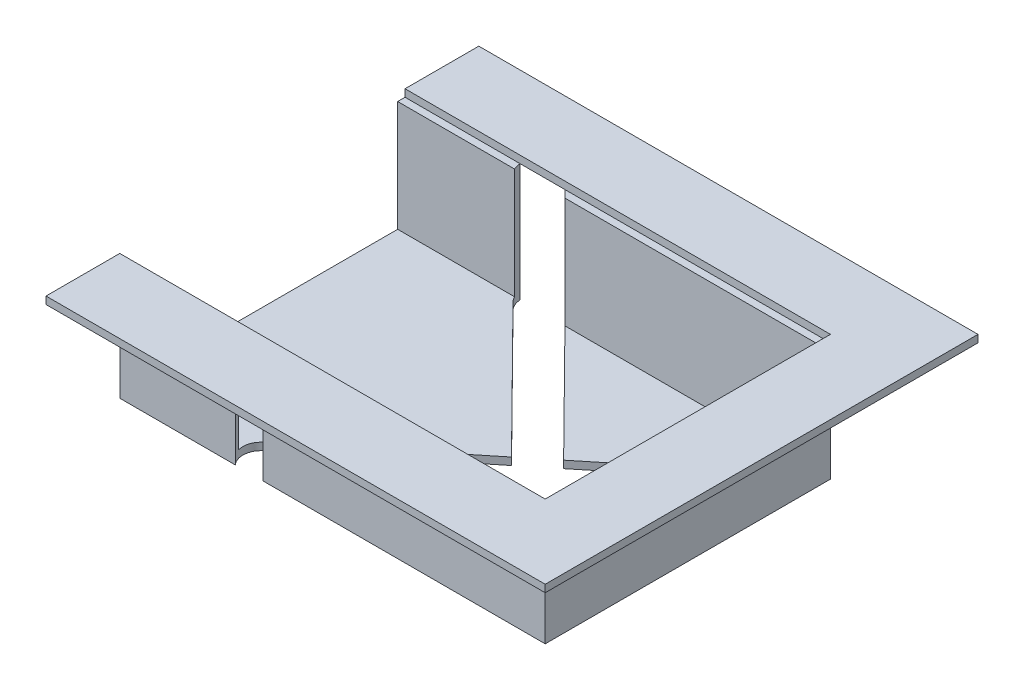
ISO-10303-21;
HEADER;
FILE_DESCRIPTION(('STEP AP214'),'2;1');
FILE_NAME('part.step','',(''),(''),'','','');
FILE_SCHEMA(('AUTOMOTIVE_DESIGN { 1 0 10303 214 1 1 1 1 }'));
ENDSEC;
DATA;
#1=APPLICATION_CONTEXT('core data for automotive mechanical design processes');
#2=APPLICATION_PROTOCOL_DEFINITION('international standard','automotive_design',2000,#1);
#3=PRODUCT_CONTEXT('',#1,'mechanical');
#4=PRODUCT('Part','Part','',(#3));
#5=PRODUCT_RELATED_PRODUCT_CATEGORY('part','',(#4));
#6=PRODUCT_DEFINITION_FORMATION('','',#4);
#7=PRODUCT_DEFINITION_CONTEXT('part definition',#1,'design');
#8=PRODUCT_DEFINITION('design','',#6,#7);
#9=PRODUCT_DEFINITION_SHAPE('','',#8);
#10=(LENGTH_UNIT() NAMED_UNIT(*) SI_UNIT(.MILLI.,.METRE.));
#11=(NAMED_UNIT(*) PLANE_ANGLE_UNIT() SI_UNIT($,.RADIAN.));
#12=(NAMED_UNIT(*) SI_UNIT($,.STERADIAN.) SOLID_ANGLE_UNIT());
#13=UNCERTAINTY_MEASURE_WITH_UNIT(LENGTH_MEASURE(1.E-05),#10,'distance_accuracy_value','');
#14=(GEOMETRIC_REPRESENTATION_CONTEXT(3) GLOBAL_UNCERTAINTY_ASSIGNED_CONTEXT((#13)) GLOBAL_UNIT_ASSIGNED_CONTEXT((#10,
#11,#12)) REPRESENTATION_CONTEXT('',''));
#15=CARTESIAN_POINT('',(0.,0.,0.));
#16=DIRECTION('',(0.,0.,1.));
#17=DIRECTION('',(1.,0.,0.));
#18=AXIS2_PLACEMENT_3D('',#15,#16,#17);
#19=CARTESIAN_POINT('',(0.,48.,0.));
#20=DIRECTION('',(0.,-1.,0.));
#21=DIRECTION('',(0.,0.,-1.));
#22=AXIS2_PLACEMENT_3D('',#19,#20,#21);
#23=PLANE('',#22);
#24=DIRECTION('',(0.776114000116265,0.,-0.630592625094466));
#25=VECTOR('',#24,1.);
#26=CARTESIAN_POINT('',(26.2072499737447,48.,32.2550768907627));
#27=LINE('',#26,#25);
#28=CARTESIAN_POINT('',(48.2617896283523,48.,14.335763421394));
#29=VERTEX_POINT('',#28);
#30=CARTESIAN_POINT('',(51.95409732066,48.,11.335763421394));
#31=VERTEX_POINT('',#30);
#32=EDGE_CURVE('E85',#29,#31,#27,.T.);
#33=ORIENTED_EDGE('',*,*,#32,.F.);
#34=DIRECTION('',(1.,0.,0.));
#35=VECTOR('',#34,1.);
#36=CARTESIAN_POINT('',(-13.016399676314,48.,14.335763421394));
#37=LINE('',#36,#35);
#38=CARTESIAN_POINT('',(162.983600323686,48.,14.3357634213939));
#39=VERTEX_POINT('',#38);
#40=EDGE_CURVE('E244',#29,#39,#37,.T.);
#41=ORIENTED_EDGE('',*,*,#40,.T.);
#42=DIRECTION('',(0.,0.,-1.));
#43=VECTOR('',#42,1.);
#44=CARTESIAN_POINT('',(162.983600323686,48.,14.3357634213939));
#45=LINE('',#44,#43);
#46=CARTESIAN_POINT('',(162.983600323686,48.,-101.664236578606));
#47=VERTEX_POINT('',#46);
#48=EDGE_CURVE('E248',#39,#47,#45,.T.);
#49=ORIENTED_EDGE('',*,*,#48,.T.);
#50=DIRECTION('',(-1.,0.,0.));
#51=VECTOR('',#50,1.);
#52=CARTESIAN_POINT('',(-13.016399676314,48.,-101.664236578606));
#53=LINE('',#52,#51);
#54=CARTESIAN_POINT('',(55.0472602840278,48.,-101.664236578606));
#55=VERTEX_POINT('',#54);
#56=EDGE_CURVE('E242',#47,#55,#53,.T.);
#57=ORIENTED_EDGE('',*,*,#56,.T.);
#58=DIRECTION('',(-0.703103929246265,0.,-0.711087100627246));
#59=VECTOR('',#58,1.);
#60=CARTESIAN_POINT('',(78.6632431835237,48.,-77.7801134640226));
#61=LINE('',#60,#59);
#62=CARTESIAN_POINT('',(58.013580142563,48.,-98.664236578606));
#63=VERTEX_POINT('',#62);
#64=EDGE_CURVE('E213',#63,#55,#61,.T.);
#65=ORIENTED_EDGE('',*,*,#64,.F.);
#66=DIRECTION('',(-1.,0.,0.));
#67=VECTOR('',#66,1.);
#68=CARTESIAN_POINT('',(0.,48.,-98.664236578606));
#69=LINE('',#68,#67);
#70=CARTESIAN_POINT('',(159.983600323686,48.,-98.664236578606));
#71=VERTEX_POINT('',#70);
#72=EDGE_CURVE('E234',#71,#63,#69,.T.);
#73=ORIENTED_EDGE('',*,*,#72,.F.);
#74=DIRECTION('',(0.,0.,-1.));
#75=VECTOR('',#74,1.);
#76=CARTESIAN_POINT('',(159.983600323686,48.,0.));
#77=LINE('',#76,#75);
#78=CARTESIAN_POINT('',(159.983600323686,48.,11.3357634213939));
#79=VERTEX_POINT('',#78);
#80=EDGE_CURVE('E263',#79,#71,#77,.T.);
#81=ORIENTED_EDGE('',*,*,#80,.F.);
#82=DIRECTION('',(1.,0.,0.));
#83=VECTOR('',#82,1.);
#84=CARTESIAN_POINT('',(0.,48.,11.335763421394));
#85=LINE('',#84,#83);
#86=EDGE_CURVE('E185',#31,#79,#85,.T.);
#87=ORIENTED_EDGE('',*,*,#86,.F.);
#88=EDGE_LOOP('',(#33,#41,#49,#57,#65,#73,#81,#87));
#89=FACE_BOUND('',#88,.T.);
#90=ADVANCED_FACE('F74',(#89),#23,.F.);
#91=CARTESIAN_POINT('',(-13.016399676314,48.,14.335763421394));
#92=DIRECTION('',(0.,0.,-1.));
#93=DIRECTION('',(-1.,0.,0.));
#94=AXIS2_PLACEMENT_3D('',#91,#92,#93);
#95=PLANE('',#94);
#96=DIRECTION('',(0.,1.,0.));
#97=VECTOR('',#96,1.);
#98=CARTESIAN_POINT('',(48.2617896283523,48.,14.335763421394));
#99=LINE('',#98,#97);
#100=CARTESIAN_POINT('',(48.2617896283523,0.,14.335763421394));
#101=VERTEX_POINT('',#100);
#102=EDGE_CURVE('E173',#101,#29,#99,.T.);
#103=ORIENTED_EDGE('',*,*,#102,.F.);
#104=DIRECTION('',(1.,0.,0.));
#105=VECTOR('',#104,1.);
#106=CARTESIAN_POINT('',(-13.016399676314,0.,14.335763421394));
#107=LINE('',#106,#105);
#108=CARTESIAN_POINT('',(162.983600323686,0.,14.3357634213939));
#109=VERTEX_POINT('',#108);
#110=EDGE_CURVE('E239',#101,#109,#107,.T.);
#111=ORIENTED_EDGE('',*,*,#110,.T.);
#112=DIRECTION('',(0.,-1.,0.));
#113=VECTOR('',#112,1.);
#114=CARTESIAN_POINT('',(162.983600323686,48.,14.3357634213939));
#115=LINE('',#114,#113);
#116=EDGE_CURVE('E268',#39,#109,#115,.T.);
#117=ORIENTED_EDGE('',*,*,#116,.F.);
#118=ORIENTED_EDGE('',*,*,#40,.F.);
#119=EDGE_LOOP('',(#103,#111,#117,#118));
#120=FACE_BOUND('',#119,.T.);
#121=ADVANCED_FACE('F387',(#120),#95,.F.);
#122=CARTESIAN_POINT('',(-13.016399676314,48.,-101.664236578606));
#123=DIRECTION('',(0.,0.,1.));
#124=DIRECTION('',(1.,0.,0.));
#125=AXIS2_PLACEMENT_3D('',#122,#123,#124);
#126=PLANE('',#125);
#127=DIRECTION('',(0.,-1.,0.));
#128=VECTOR('',#127,1.);
#129=CARTESIAN_POINT('',(55.0472602840278,48.,-101.664236578606));
#130=LINE('',#129,#128);
#131=CARTESIAN_POINT('',(55.0472602840278,0.,-101.664236578606));
#132=VERTEX_POINT('',#131);
#133=EDGE_CURVE('E284',#55,#132,#130,.T.);
#134=ORIENTED_EDGE('',*,*,#133,.F.);
#135=ORIENTED_EDGE('',*,*,#56,.F.);
#136=DIRECTION('',(0.,-1.,0.));
#137=VECTOR('',#136,1.);
#138=CARTESIAN_POINT('',(162.983600323686,48.,-101.664236578606));
#139=LINE('',#138,#137);
#140=CARTESIAN_POINT('',(162.983600323686,0.,-101.664236578606));
#141=VERTEX_POINT('',#140);
#142=EDGE_CURVE('E199',#47,#141,#139,.T.);
#143=ORIENTED_EDGE('',*,*,#142,.T.);
#144=DIRECTION('',(-1.,0.,0.));
#145=VECTOR('',#144,1.);
#146=CARTESIAN_POINT('',(-13.016399676314,0.,-101.664236578606));
#147=LINE('',#146,#145);
#148=EDGE_CURVE('E194',#141,#132,#147,.T.);
#149=ORIENTED_EDGE('',*,*,#148,.T.);
#150=EDGE_LOOP('',(#134,#135,#143,#149));
#151=FACE_BOUND('',#150,.T.);
#152=ADVANCED_FACE('F337',(#151),#126,.F.);
#153=CARTESIAN_POINT('',(0.,0.,0.));
#154=DIRECTION('',(0.,-1.,0.));
#155=DIRECTION('',(0.,0.,-1.));
#156=AXIS2_PLACEMENT_3D('',#153,#154,#155);
#157=PLANE('',#156);
#158=DIRECTION('',(0.776114000116265,0.,-0.630592625094466));
#159=VECTOR('',#158,1.);
#160=CARTESIAN_POINT('',(37.8067456279203,0.,3.50342905166223));
#161=LINE('',#160,#159);
#162=CARTESIAN_POINT('',(105.029187716654,0.,-51.1148051454342));
#163=VERTEX_POINT('',#162);
#164=CARTESIAN_POINT('',(138.701565643035,0.,-78.4736122106184));
#165=VERTEX_POINT('',#164);
#166=EDGE_CURVE('E211',#163,#165,#161,.T.);
#167=ORIENTED_EDGE('',*,*,#166,.F.);
#168=DIRECTION('',(-0.703103929246265,0.,-0.711087100627246));
#169=VECTOR('',#168,1.);
#170=CARTESIAN_POINT('',(141.018508979398,0.,-14.7168545071821));
#171=LINE('',#170,#169);
#172=EDGE_CURVE('E188',#163,#132,#171,.T.);
#173=ORIENTED_EDGE('',*,*,#172,.T.);
#174=ORIENTED_EDGE('',*,*,#148,.F.);
#175=DIRECTION('',(0.,0.,-1.));
#176=VECTOR('',#175,1.);
#177=CARTESIAN_POINT('',(162.983600323686,0.,14.3357634213939));
#178=LINE('',#177,#176);
#179=EDGE_CURVE('E229',#109,#141,#178,.T.);
#180=ORIENTED_EDGE('',*,*,#179,.F.);
#181=ORIENTED_EDGE('',*,*,#110,.F.);
#182=DIRECTION('',(0.776114000116265,0.,-0.630592625094466));
#183=VECTOR('',#182,1.);
#184=CARTESIAN_POINT('',(47.2656350043372,0.,15.1451390534062));
#185=LINE('',#184,#183);
#186=CARTESIAN_POINT('',(103.928817384258,0.,-30.8936966302796));
#187=VERTEX_POINT('',#186);
#188=EDGE_CURVE('E94',#101,#187,#185,.T.);
#189=ORIENTED_EDGE('',*,*,#188,.T.);
#190=DIRECTION('',(-0.703103929246265,0.,-0.711087100627246));
#191=VECTOR('',#190,1.);
#192=CARTESIAN_POINT('',(130.352202469989,0.,-4.17029556848807));
#193=LINE('',#192,#191);
#194=CARTESIAN_POINT('',(130.352202469989,0.,-4.17029556848807));
#195=VERTEX_POINT('',#194);
#196=EDGE_CURVE('E78',#195,#187,#193,.T.);
#197=ORIENTED_EDGE('',*,*,#196,.F.);
#198=CARTESIAN_POINT('',(135.685355724693,0.,-9.44357503783506));
#199=DIRECTION('',(0.,-1.,0.));
#200=DIRECTION('',(0.,0.,-1.));
#201=AXIS2_PLACEMENT_3D('',#198,#199,#200);
#202=CIRCLE('',#201,7.50000000000003);
#203=CARTESIAN_POINT('',(141.018508979398,0.,-14.7168545071821));
#204=VERTEX_POINT('',#203);
#205=EDGE_CURVE('E205',#204,#195,#202,.T.);
#206=ORIENTED_EDGE('',*,*,#205,.F.);
#207=CARTESIAN_POINT('',(115.626009430624,0.,-40.3976651679516));
#208=VERTEX_POINT('',#207);
#209=EDGE_CURVE('E178',#204,#208,#171,.T.);
#210=ORIENTED_EDGE('',*,*,#209,.T.);
#211=CARTESIAN_POINT('',(148.160455019452,0.,-66.8319022088744));
#212=VERTEX_POINT('',#211);
#213=EDGE_CURVE('E154',#208,#212,#185,.T.);
#214=ORIENTED_EDGE('',*,*,#213,.T.);
#215=CARTESIAN_POINT('',(143.431010331243,0.,-72.6527572097464));
#216=DIRECTION('',(0.,-1.,0.));
#217=DIRECTION('',(0.,0.,-1.));
#218=AXIS2_PLACEMENT_3D('',#215,#216,#217);
#219=CIRCLE('',#218,7.49999999999999);
#220=EDGE_CURVE('E165',#165,#212,#219,.T.);
#221=ORIENTED_EDGE('',*,*,#220,.F.);
#222=EDGE_LOOP('',(#167,#173,#174,#180,#181,#189,#197,#206,#210,#214,#221));
#223=FACE_BOUND('',#222,.T.);
#224=ADVANCED_FACE('F175',(#223),#157,.T.);
#225=CARTESIAN_POINT('',(-13.016399676314,48.,11.335763421394));
#226=DIRECTION('',(0.,0.,-1.));
#227=DIRECTION('',(-1.,0.,0.));
#228=AXIS2_PLACEMENT_3D('',#225,#226,#227);
#229=PLANE('',#228);
#230=DIRECTION('',(1.,0.,0.));
#231=VECTOR('',#230,1.);
#232=CARTESIAN_POINT('',(0.,3.,11.335763421394));
#233=LINE('',#232,#231);
#234=CARTESIAN_POINT('',(51.95409732066,3.,11.335763421394));
#235=VERTEX_POINT('',#234);
#236=CARTESIAN_POINT('',(159.983600323686,3.,11.3357634213939));
#237=VERTEX_POINT('',#236);
#238=EDGE_CURVE('E219',#235,#237,#233,.T.);
#239=ORIENTED_EDGE('',*,*,#238,.F.);
#240=DIRECTION('',(0.,1.,0.));
#241=VECTOR('',#240,1.);
#242=CARTESIAN_POINT('',(51.95409732066,48.,11.335763421394));
#243=LINE('',#242,#241);
#244=EDGE_CURVE('E180',#235,#31,#243,.T.);
#245=ORIENTED_EDGE('',*,*,#244,.T.);
#246=ORIENTED_EDGE('',*,*,#86,.T.);
#247=DIRECTION('',(0.,-1.,0.));
#248=VECTOR('',#247,1.);
#249=CARTESIAN_POINT('',(159.983600323686,48.,11.3357634213939));
#250=LINE('',#249,#248);
#251=EDGE_CURVE('E233',#79,#237,#250,.T.);
#252=ORIENTED_EDGE('',*,*,#251,.T.);
#253=EDGE_LOOP('',(#239,#245,#246,#252));
#254=FACE_BOUND('',#253,.T.);
#255=ADVANCED_FACE('F383',(#254),#229,.T.);
#256=CARTESIAN_POINT('',(-13.016399676314,48.,-98.664236578606));
#257=DIRECTION('',(0.,0.,1.));
#258=DIRECTION('',(1.,0.,0.));
#259=AXIS2_PLACEMENT_3D('',#256,#257,#258);
#260=PLANE('',#259);
#261=ORIENTED_EDGE('',*,*,#72,.T.);
#262=DIRECTION('',(0.,-1.,0.));
#263=VECTOR('',#262,1.);
#264=CARTESIAN_POINT('',(58.013580142563,48.,-98.664236578606));
#265=LINE('',#264,#263);
#266=CARTESIAN_POINT('',(58.013580142563,3.,-98.664236578606));
#267=VERTEX_POINT('',#266);
#268=EDGE_CURVE('E238',#63,#267,#265,.T.);
#269=ORIENTED_EDGE('',*,*,#268,.T.);
#270=DIRECTION('',(-1.,0.,0.));
#271=VECTOR('',#270,1.);
#272=CARTESIAN_POINT('',(0.,3.,-98.664236578606));
#273=LINE('',#272,#271);
#274=CARTESIAN_POINT('',(159.983600323686,3.,-98.664236578606));
#275=VERTEX_POINT('',#274);
#276=EDGE_CURVE('E225',#275,#267,#273,.T.);
#277=ORIENTED_EDGE('',*,*,#276,.F.);
#278=DIRECTION('',(0.,-1.,0.));
#279=VECTOR('',#278,1.);
#280=CARTESIAN_POINT('',(159.983600323686,48.,-98.664236578606));
#281=LINE('',#280,#279);
#282=EDGE_CURVE('E267',#71,#275,#281,.T.);
#283=ORIENTED_EDGE('',*,*,#282,.F.);
#284=EDGE_LOOP('',(#261,#269,#277,#283));
#285=FACE_BOUND('',#284,.T.);
#286=ADVANCED_FACE('F356',(#285),#260,.T.);
#287=CARTESIAN_POINT('',(0.,3.,0.));
#288=DIRECTION('',(0.,-1.,0.));
#289=DIRECTION('',(0.,0.,-1.));
#290=AXIS2_PLACEMENT_3D('',#287,#288,#289);
#291=PLANE('',#290);
#292=DIRECTION('',(-0.703103929246265,0.,-0.711087100627246));
#293=VECTOR('',#292,1.);
#294=CARTESIAN_POINT('',(78.6632431835237,3.,-77.7801134640226));
#295=LINE('',#294,#293);
#296=CARTESIAN_POINT('',(105.029187716654,3.,-51.1148051454342));
#297=VERTEX_POINT('',#296);
#298=EDGE_CURVE('E216',#297,#267,#295,.T.);
#299=ORIENTED_EDGE('',*,*,#298,.F.);
#300=DIRECTION('',(0.776114000116265,0.,-0.630592625094466));
#301=VECTOR('',#300,1.);
#302=CARTESIAN_POINT('',(16.7483605973277,3.,20.6133668890187));
#303=LINE('',#302,#301);
#304=CARTESIAN_POINT('',(138.701565643035,3.,-78.4736122106184));
#305=VERTEX_POINT('',#304);
#306=EDGE_CURVE('E291',#297,#305,#303,.T.);
#307=ORIENTED_EDGE('',*,*,#306,.T.);
#308=CARTESIAN_POINT('',(143.431010331243,3.,-72.6527572097464));
#309=DIRECTION('',(0.,-1.,0.));
#310=DIRECTION('',(0.,0.,-1.));
#311=AXIS2_PLACEMENT_3D('',#308,#309,#310);
#312=CIRCLE('',#311,7.49999999999999);
#313=CARTESIAN_POINT('',(148.160455019452,3.,-66.8319022088744));
#314=VERTEX_POINT('',#313);
#315=EDGE_CURVE('E320',#305,#314,#312,.T.);
#316=ORIENTED_EDGE('',*,*,#315,.T.);
#317=DIRECTION('',(0.776114000116265,0.,-0.630592625094466));
#318=VECTOR('',#317,1.);
#319=CARTESIAN_POINT('',(26.2072499737447,3.,32.2550768907627));
#320=LINE('',#319,#318);
#321=CARTESIAN_POINT('',(115.626009430624,3.,-40.3976651679516));
#322=VERTEX_POINT('',#321);
#323=EDGE_CURVE('E157',#322,#314,#320,.T.);
#324=ORIENTED_EDGE('',*,*,#323,.F.);
#325=DIRECTION('',(-0.703103929246265,0.,-0.711087100627246));
#326=VECTOR('',#325,1.);
#327=CARTESIAN_POINT('',(78.6632431835237,3.,-77.7801134640226));
#328=LINE('',#327,#326);
#329=CARTESIAN_POINT('',(141.018508979398,3.,-14.7168545071821));
#330=VERTEX_POINT('',#329);
#331=EDGE_CURVE('E272',#330,#322,#328,.T.);
#332=ORIENTED_EDGE('',*,*,#331,.F.);
#333=CARTESIAN_POINT('',(135.685355724693,3.,-9.44357503783506));
#334=DIRECTION('',(0.,-1.,0.));
#335=DIRECTION('',(0.,0.,-1.));
#336=AXIS2_PLACEMENT_3D('',#333,#334,#335);
#337=CIRCLE('',#336,7.50000000000003);
#338=CARTESIAN_POINT('',(130.352202469989,3.,-4.17029556848807));
#339=VERTEX_POINT('',#338);
#340=EDGE_CURVE('E311',#330,#339,#337,.T.);
#341=ORIENTED_EDGE('',*,*,#340,.T.);
#342=DIRECTION('',(-0.703103929246265,0.,-0.711087100627246));
#343=VECTOR('',#342,1.);
#344=CARTESIAN_POINT('',(67.996936674115,3.,-67.2335545253286));
#345=LINE('',#344,#343);
#346=CARTESIAN_POINT('',(103.928817384258,3.,-30.8936966302796));
#347=VERTEX_POINT('',#346);
#348=EDGE_CURVE('E224',#339,#347,#345,.T.);
#349=ORIENTED_EDGE('',*,*,#348,.T.);
#350=DIRECTION('',(0.776114000116265,0.,-0.630592625094466));
#351=VECTOR('',#350,1.);
#352=CARTESIAN_POINT('',(26.2072499737447,3.,32.2550768907627));
#353=LINE('',#352,#351);
#354=EDGE_CURVE('E13',#235,#347,#353,.T.);
#355=ORIENTED_EDGE('',*,*,#354,.F.);
#356=ORIENTED_EDGE('',*,*,#238,.T.);
#357=DIRECTION('',(0.,0.,-1.));
#358=VECTOR('',#357,1.);
#359=CARTESIAN_POINT('',(159.983600323686,3.,0.));
#360=LINE('',#359,#358);
#361=EDGE_CURVE('E223',#237,#275,#360,.T.);
#362=ORIENTED_EDGE('',*,*,#361,.T.);
#363=ORIENTED_EDGE('',*,*,#276,.T.);
#364=EDGE_LOOP('',(#299,#307,#316,#324,#332,#341,#349,#355,#356,#362,#363));
#365=FACE_BOUND('',#364,.T.);
#366=ADVANCED_FACE('F318',(#365),#291,.F.);
#367=CARTESIAN_POINT('',(162.983600323686,48.,14.3357634213939));
#368=DIRECTION('',(-1.,0.,0.));
#369=DIRECTION('',(0.,0.,1.));
#370=AXIS2_PLACEMENT_3D('',#367,#368,#369);
#371=PLANE('',#370);
#372=ORIENTED_EDGE('',*,*,#179,.T.);
#373=ORIENTED_EDGE('',*,*,#142,.F.);
#374=ORIENTED_EDGE('',*,*,#48,.F.);
#375=ORIENTED_EDGE('',*,*,#116,.T.);
#376=EDGE_LOOP('',(#372,#373,#374,#375));
#377=FACE_BOUND('',#376,.T.);
#378=ADVANCED_FACE('F388',(#377),#371,.F.);
#379=CARTESIAN_POINT('',(159.983600323686,48.,14.3357634213939));
#380=DIRECTION('',(-1.,0.,0.));
#381=DIRECTION('',(0.,0.,1.));
#382=AXIS2_PLACEMENT_3D('',#379,#380,#381);
#383=PLANE('',#382);
#384=ORIENTED_EDGE('',*,*,#361,.F.);
#385=ORIENTED_EDGE('',*,*,#251,.F.);
#386=ORIENTED_EDGE('',*,*,#80,.T.);
#387=ORIENTED_EDGE('',*,*,#282,.T.);
#388=EDGE_LOOP('',(#384,#385,#386,#387));
#389=FACE_BOUND('',#388,.T.);
#390=ADVANCED_FACE('F366',(#389),#383,.T.);
#391=CARTESIAN_POINT('',(141.018508979398,51.,-14.7168545071821));
#392=DIRECTION('',(-0.711087100627246,0.,0.703103929246265));
#393=DIRECTION('',(0.703103929246265,0.,0.711087100627246));
#394=AXIS2_PLACEMENT_3D('',#391,#392,#393);
#395=PLANE('',#394);
#396=ORIENTED_EDGE('',*,*,#331,.T.);
#397=DIRECTION('',(0.,1.,0.));
#398=VECTOR('',#397,1.);
#399=CARTESIAN_POINT('',(115.626009430624,51.,-40.3976651679516));
#400=LINE('',#399,#398);
#401=EDGE_CURVE('E161',#208,#322,#400,.T.);
#402=ORIENTED_EDGE('',*,*,#401,.F.);
#403=ORIENTED_EDGE('',*,*,#209,.F.);
#404=DIRECTION('',(0.,-1.,0.));
#405=VECTOR('',#404,1.);
#406=CARTESIAN_POINT('',(141.018508979398,51.,-14.7168545071821));
#407=LINE('',#406,#405);
#408=EDGE_CURVE('E203',#330,#204,#407,.T.);
#409=ORIENTED_EDGE('',*,*,#408,.F.);
#410=EDGE_LOOP('',(#396,#402,#403,#409));
#411=FACE_BOUND('',#410,.T.);
#412=ADVANCED_FACE('F315',(#411),#395,.T.);
#413=CARTESIAN_POINT('',(135.685355724693,51.,-9.44357503783506));
#414=DIRECTION('',(0.,-1.,0.));
#415=DIRECTION('',(0.,0.,-1.));
#416=AXIS2_PLACEMENT_3D('',#413,#414,#415);
#417=CYLINDRICAL_SURFACE('',#416,7.50000000000003);
#418=ORIENTED_EDGE('',*,*,#408,.T.);
#419=ORIENTED_EDGE('',*,*,#205,.T.);
#420=DIRECTION('',(0.,-1.,0.));
#421=VECTOR('',#420,1.);
#422=CARTESIAN_POINT('',(130.352202469989,51.,-4.17029556848807));
#423=LINE('',#422,#421);
#424=EDGE_CURVE('E209',#339,#195,#423,.T.);
#425=ORIENTED_EDGE('',*,*,#424,.F.);
#426=ORIENTED_EDGE('',*,*,#340,.F.);
#427=EDGE_LOOP('',(#418,#419,#425,#426));
#428=FACE_BOUND('',#427,.T.);
#429=ADVANCED_FACE('F307',(#428),#417,.F.);
#430=CARTESIAN_POINT('',(130.352202469989,51.,-4.17029556848807));
#431=DIRECTION('',(-0.711087100627246,0.,0.703103929246265));
#432=DIRECTION('',(0.703103929246265,0.,0.711087100627246));
#433=AXIS2_PLACEMENT_3D('',#430,#431,#432);
#434=PLANE('',#433);
#435=ORIENTED_EDGE('',*,*,#424,.T.);
#436=ORIENTED_EDGE('',*,*,#196,.T.);
#437=DIRECTION('',(0.,1.,0.));
#438=VECTOR('',#437,1.);
#439=CARTESIAN_POINT('',(103.928817384258,51.,-30.8936966302796));
#440=LINE('',#439,#438);
#441=EDGE_CURVE('E297',#187,#347,#440,.T.);
#442=ORIENTED_EDGE('',*,*,#441,.T.);
#443=ORIENTED_EDGE('',*,*,#348,.F.);
#444=EDGE_LOOP('',(#435,#436,#442,#443));
#445=FACE_BOUND('',#444,.T.);
#446=ADVANCED_FACE('F76',(#445),#434,.F.);
#447=CARTESIAN_POINT('',(47.2656350043372,51.,15.1451390534062));
#448=DIRECTION('',(-0.630592625094466,0.,-0.776114000116265));
#449=DIRECTION('',(-0.776114000116265,0.,0.630592625094466));
#450=AXIS2_PLACEMENT_3D('',#447,#448,#449);
#451=PLANE('',#450);
#452=ORIENTED_EDGE('',*,*,#323,.T.);
#453=DIRECTION('',(0.,-1.,0.));
#454=VECTOR('',#453,1.);
#455=CARTESIAN_POINT('',(148.160455019452,51.,-66.8319022088744));
#456=LINE('',#455,#454);
#457=EDGE_CURVE('E149',#314,#212,#456,.T.);
#458=ORIENTED_EDGE('',*,*,#457,.T.);
#459=ORIENTED_EDGE('',*,*,#213,.F.);
#460=ORIENTED_EDGE('',*,*,#401,.T.);
#461=EDGE_LOOP('',(#452,#458,#459,#460));
#462=FACE_BOUND('',#461,.T.);
#463=ADVANCED_FACE('F151',(#462),#451,.T.);
#464=ORIENTED_EDGE('',*,*,#133,.T.);
#465=ORIENTED_EDGE('',*,*,#172,.F.);
#466=DIRECTION('',(0.,1.,0.));
#467=VECTOR('',#466,1.);
#468=CARTESIAN_POINT('',(105.029187716654,51.,-51.1148051454342));
#469=LINE('',#468,#467);
#470=EDGE_CURVE('E286',#163,#297,#469,.T.);
#471=ORIENTED_EDGE('',*,*,#470,.T.);
#472=ORIENTED_EDGE('',*,*,#298,.T.);
#473=ORIENTED_EDGE('',*,*,#268,.F.);
#474=ORIENTED_EDGE('',*,*,#64,.T.);
#475=EDGE_LOOP('',(#464,#465,#471,#472,#473,#474));
#476=FACE_BOUND('',#475,.T.);
#477=ADVANCED_FACE('F353',(#476),#395,.T.);
#478=CARTESIAN_POINT('',(37.8067456279203,51.,3.50342905166223));
#479=DIRECTION('',(-0.630592625094466,0.,-0.776114000116265));
#480=DIRECTION('',(-0.776114000116265,0.,0.630592625094466));
#481=AXIS2_PLACEMENT_3D('',#478,#479,#480);
#482=PLANE('',#481);
#483=ORIENTED_EDGE('',*,*,#470,.F.);
#484=ORIENTED_EDGE('',*,*,#166,.T.);
#485=DIRECTION('',(0.,-1.,0.));
#486=VECTOR('',#485,1.);
#487=CARTESIAN_POINT('',(138.701565643035,51.,-78.4736122106184));
#488=LINE('',#487,#486);
#489=EDGE_CURVE('E168',#305,#165,#488,.T.);
#490=ORIENTED_EDGE('',*,*,#489,.F.);
#491=ORIENTED_EDGE('',*,*,#306,.F.);
#492=EDGE_LOOP('',(#483,#484,#490,#491));
#493=FACE_BOUND('',#492,.T.);
#494=ADVANCED_FACE('F405',(#493),#482,.F.);
#495=CARTESIAN_POINT('',(143.431010331243,51.,-72.6527572097464));
#496=DIRECTION('',(0.,-1.,0.));
#497=DIRECTION('',(0.,0.,-1.));
#498=AXIS2_PLACEMENT_3D('',#495,#496,#497);
#499=CYLINDRICAL_SURFACE('',#498,7.49999999999999);
#500=ORIENTED_EDGE('',*,*,#489,.T.);
#501=ORIENTED_EDGE('',*,*,#220,.T.);
#502=ORIENTED_EDGE('',*,*,#457,.F.);
#503=ORIENTED_EDGE('',*,*,#315,.F.);
#504=EDGE_LOOP('',(#500,#501,#502,#503));
#505=FACE_BOUND('',#504,.T.);
#506=ADVANCED_FACE('F166',(#505),#499,.F.);
#507=ORIENTED_EDGE('',*,*,#102,.T.);
#508=ORIENTED_EDGE('',*,*,#32,.T.);
#509=ORIENTED_EDGE('',*,*,#244,.F.);
#510=ORIENTED_EDGE('',*,*,#354,.T.);
#511=ORIENTED_EDGE('',*,*,#441,.F.);
#512=ORIENTED_EDGE('',*,*,#188,.F.);
#513=EDGE_LOOP('',(#507,#508,#509,#510,#511,#512));
#514=FACE_BOUND('',#513,.T.);
#515=ADVANCED_FACE('F380',(#514),#451,.T.);
#516=CLOSED_SHELL('',(#90,#121,#152,#224,#255,#286,#366,#378,#390,#412,#429,#446,#463,#477,#494,
#506,#515));
#517=MANIFOLD_SOLID_BREP('B2',#516);
#518=CARTESIAN_POINT('',(0.,51.,0.));
#519=DIRECTION('',(0.,1.,0.));
#520=DIRECTION('',(0.,0.,1.));
#521=AXIS2_PLACEMENT_3D('',#518,#519,#520);
#522=PLANE('',#521);
#523=DIRECTION('',(0.,0.,-1.));
#524=VECTOR('',#523,1.);
#525=CARTESIAN_POINT('',(-10.016399676314,51.,51.335763421394));
#526=LINE('',#525,#524);
#527=CARTESIAN_POINT('',(-10.016399676314,51.,44.335763421394));
#528=VERTEX_POINT('',#527);
#529=CARTESIAN_POINT('',(-10.016399676314,51.,14.335763421394));
#530=VERTEX_POINT('',#529);
#531=EDGE_CURVE('E556',#528,#530,#526,.T.);
#532=ORIENTED_EDGE('',*,*,#531,.F.);
#533=DIRECTION('',(1.,0.,0.));
#534=VECTOR('',#533,1.);
#535=CARTESIAN_POINT('',(-43.0163996763139,51.,44.335763421394));
#536=LINE('',#535,#534);
#537=CARTESIAN_POINT('',(192.983600323686,51.,44.3357634213939));
#538=VERTEX_POINT('',#537);
#539=EDGE_CURVE('E622',#528,#538,#536,.T.);
#540=ORIENTED_EDGE('',*,*,#539,.T.);
#541=DIRECTION('',(0.,0.,-1.));
#542=VECTOR('',#541,1.);
#543=CARTESIAN_POINT('',(192.983600323686,51.,44.3357634213939));
#544=LINE('',#543,#542);
#545=CARTESIAN_POINT('',(192.983600323686,51.,-131.664236578606));
#546=VERTEX_POINT('',#545);
#547=EDGE_CURVE('E617',#538,#546,#544,.T.);
#548=ORIENTED_EDGE('',*,*,#547,.T.);
#549=DIRECTION('',(-1.,0.,0.));
#550=VECTOR('',#549,1.);
#551=CARTESIAN_POINT('',(192.983600323686,51.,-131.664236578606));
#552=LINE('',#551,#550);
#553=CARTESIAN_POINT('',(-10.016399676314,51.,-131.664236578606));
#554=VERTEX_POINT('',#553);
#555=EDGE_CURVE('E611',#546,#554,#552,.T.);
#556=ORIENTED_EDGE('',*,*,#555,.T.);
#557=CARTESIAN_POINT('',(-10.016399676314,51.,-101.664236578606));
#558=VERTEX_POINT('',#557);
#559=EDGE_CURVE('E596',#558,#554,#526,.T.);
#560=ORIENTED_EDGE('',*,*,#559,.F.);
#561=DIRECTION('',(-1.,0.,0.));
#562=VECTOR('',#561,1.);
#563=CARTESIAN_POINT('',(162.983600323686,51.,-101.664236578606));
#564=LINE('',#563,#562);
#565=CARTESIAN_POINT('',(162.983600323686,51.,-101.664236578606));
#566=VERTEX_POINT('',#565);
#567=EDGE_CURVE('E654',#566,#558,#564,.T.);
#568=ORIENTED_EDGE('',*,*,#567,.F.);
#569=DIRECTION('',(0.,0.,-1.));
#570=VECTOR('',#569,1.);
#571=CARTESIAN_POINT('',(162.983600323686,51.,14.3357634213939));
#572=LINE('',#571,#570);
#573=CARTESIAN_POINT('',(162.983600323686,51.,14.3357634213939));
#574=VERTEX_POINT('',#573);
#575=EDGE_CURVE('E659',#574,#566,#572,.T.);
#576=ORIENTED_EDGE('',*,*,#575,.F.);
#577=DIRECTION('',(1.,0.,0.));
#578=VECTOR('',#577,1.);
#579=CARTESIAN_POINT('',(-13.016399676314,51.,14.335763421394));
#580=LINE('',#579,#578);
#581=EDGE_CURVE('E656',#530,#574,#580,.T.);
#582=ORIENTED_EDGE('',*,*,#581,.F.);
#583=EDGE_LOOP('',(#532,#540,#548,#556,#560,#568,#576,#582));
#584=FACE_BOUND('',#583,.T.);
#585=ADVANCED_FACE('F534',(#584),#522,.T.);
#586=CARTESIAN_POINT('',(0.,48.,0.));
#587=DIRECTION('',(0.,1.,0.));
#588=DIRECTION('',(0.,0.,1.));
#589=AXIS2_PLACEMENT_3D('',#586,#587,#588);
#590=PLANE('',#589);
#591=DIRECTION('',(1.,0.,0.));
#592=VECTOR('',#591,1.);
#593=CARTESIAN_POINT('',(-43.0163996763139,48.,44.335763421394));
#594=LINE('',#593,#592);
#595=CARTESIAN_POINT('',(-10.016399676314,48.,44.335763421394));
#596=VERTEX_POINT('',#595);
#597=CARTESIAN_POINT('',(192.983600323686,48.,44.3357634213939));
#598=VERTEX_POINT('',#597);
#599=EDGE_CURVE('E626',#596,#598,#594,.T.);
#600=ORIENTED_EDGE('',*,*,#599,.F.);
#601=DIRECTION('',(0.,0.,-1.));
#602=VECTOR('',#601,1.);
#603=CARTESIAN_POINT('',(-10.016399676314,48.,0.));
#604=LINE('',#603,#602);
#605=CARTESIAN_POINT('',(-10.016399676314,48.,14.335763421394));
#606=VERTEX_POINT('',#605);
#607=EDGE_CURVE('E614',#596,#606,#604,.T.);
#608=ORIENTED_EDGE('',*,*,#607,.T.);
#609=DIRECTION('',(1.,0.,0.));
#610=VECTOR('',#609,1.);
#611=CARTESIAN_POINT('',(-13.016399676314,48.,14.335763421394));
#612=LINE('',#611,#610);
#613=CARTESIAN_POINT('',(162.983600323686,48.,14.3357634213939));
#614=VERTEX_POINT('',#613);
#615=EDGE_CURVE('E646',#606,#614,#612,.T.);
#616=ORIENTED_EDGE('',*,*,#615,.T.);
#617=DIRECTION('',(0.,0.,-1.));
#618=VECTOR('',#617,1.);
#619=CARTESIAN_POINT('',(162.983600323686,48.,14.3357634213939));
#620=LINE('',#619,#618);
#621=CARTESIAN_POINT('',(162.983600323686,48.,-101.664236578606));
#622=VERTEX_POINT('',#621);
#623=EDGE_CURVE('E657',#614,#622,#620,.T.);
#624=ORIENTED_EDGE('',*,*,#623,.T.);
#625=DIRECTION('',(-1.,0.,0.));
#626=VECTOR('',#625,1.);
#627=CARTESIAN_POINT('',(162.983600323686,48.,-101.664236578606));
#628=LINE('',#627,#626);
#629=CARTESIAN_POINT('',(-10.016399676314,48.,-101.664236578606));
#630=VERTEX_POINT('',#629);
#631=EDGE_CURVE('E644',#622,#630,#628,.T.);
#632=ORIENTED_EDGE('',*,*,#631,.T.);
#633=CARTESIAN_POINT('',(-10.016399676314,48.,-131.664236578606));
#634=VERTEX_POINT('',#633);
#635=EDGE_CURVE('E549',#630,#634,#604,.T.);
#636=ORIENTED_EDGE('',*,*,#635,.T.);
#637=DIRECTION('',(-1.,0.,0.));
#638=VECTOR('',#637,1.);
#639=CARTESIAN_POINT('',(192.983600323686,48.,-131.664236578606));
#640=LINE('',#639,#638);
#641=CARTESIAN_POINT('',(192.983600323686,48.,-131.664236578606));
#642=VERTEX_POINT('',#641);
#643=EDGE_CURVE('E613',#642,#634,#640,.T.);
#644=ORIENTED_EDGE('',*,*,#643,.F.);
#645=DIRECTION('',(0.,0.,-1.));
#646=VECTOR('',#645,1.);
#647=CARTESIAN_POINT('',(192.983600323686,48.,44.3357634213939));
#648=LINE('',#647,#646);
#649=EDGE_CURVE('E628',#598,#642,#648,.T.);
#650=ORIENTED_EDGE('',*,*,#649,.F.);
#651=EDGE_LOOP('',(#600,#608,#616,#624,#632,#636,#644,#650));
#652=FACE_BOUND('',#651,.T.);
#653=ADVANCED_FACE('F640',(#652),#590,.F.);
#654=CARTESIAN_POINT('',(-43.0163996763139,51.,44.335763421394));
#655=DIRECTION('',(0.,0.,-1.));
#656=DIRECTION('',(-1.,0.,0.));
#657=AXIS2_PLACEMENT_3D('',#654,#655,#656);
#658=PLANE('',#657);
#659=ORIENTED_EDGE('',*,*,#539,.F.);
#660=DIRECTION('',(0.,-1.,0.));
#661=VECTOR('',#660,1.);
#662=CARTESIAN_POINT('',(-10.016399676314,51.,44.335763421394));
#663=LINE('',#662,#661);
#664=EDGE_CURVE('E648',#528,#596,#663,.T.);
#665=ORIENTED_EDGE('',*,*,#664,.T.);
#666=ORIENTED_EDGE('',*,*,#599,.T.);
#667=DIRECTION('',(0.,-1.,0.));
#668=VECTOR('',#667,1.);
#669=CARTESIAN_POINT('',(192.983600323686,51.,44.3357634213939));
#670=LINE('',#669,#668);
#671=EDGE_CURVE('E542',#538,#598,#670,.T.);
#672=ORIENTED_EDGE('',*,*,#671,.F.);
#673=EDGE_LOOP('',(#659,#665,#666,#672));
#674=FACE_BOUND('',#673,.T.);
#675=ADVANCED_FACE('F536',(#674),#658,.F.);
#676=CARTESIAN_POINT('',(192.983600323686,51.,44.3357634213939));
#677=DIRECTION('',(-1.,0.,0.));
#678=DIRECTION('',(0.,0.,1.));
#679=AXIS2_PLACEMENT_3D('',#676,#677,#678);
#680=PLANE('',#679);
#681=ORIENTED_EDGE('',*,*,#649,.T.);
#682=DIRECTION('',(0.,-1.,0.));
#683=VECTOR('',#682,1.);
#684=CARTESIAN_POINT('',(192.983600323686,51.,-131.664236578606));
#685=LINE('',#684,#683);
#686=EDGE_CURVE('E619',#546,#642,#685,.T.);
#687=ORIENTED_EDGE('',*,*,#686,.F.);
#688=ORIENTED_EDGE('',*,*,#547,.F.);
#689=ORIENTED_EDGE('',*,*,#671,.T.);
#690=EDGE_LOOP('',(#681,#687,#688,#689));
#691=FACE_BOUND('',#690,.T.);
#692=ADVANCED_FACE('F635',(#691),#680,.F.);
#693=CARTESIAN_POINT('',(192.983600323686,51.,-131.664236578606));
#694=DIRECTION('',(0.,0.,1.));
#695=DIRECTION('',(1.,0.,0.));
#696=AXIS2_PLACEMENT_3D('',#693,#694,#695);
#697=PLANE('',#696);
#698=ORIENTED_EDGE('',*,*,#643,.T.);
#699=DIRECTION('',(0.,1.,0.));
#700=VECTOR('',#699,1.);
#701=CARTESIAN_POINT('',(-10.016399676314,0.,-131.664236578606));
#702=LINE('',#701,#700);
#703=EDGE_CURVE('E599',#634,#554,#702,.T.);
#704=ORIENTED_EDGE('',*,*,#703,.T.);
#705=ORIENTED_EDGE('',*,*,#555,.F.);
#706=ORIENTED_EDGE('',*,*,#686,.T.);
#707=EDGE_LOOP('',(#698,#704,#705,#706));
#708=FACE_BOUND('',#707,.T.);
#709=ADVANCED_FACE('F609',(#708),#697,.F.);
#710=CARTESIAN_POINT('',(162.983600323686,51.,-101.664236578606));
#711=DIRECTION('',(0.,0.,1.));
#712=DIRECTION('',(1.,0.,0.));
#713=AXIS2_PLACEMENT_3D('',#710,#711,#712);
#714=PLANE('',#713);
#715=DIRECTION('',(0.,1.,0.));
#716=VECTOR('',#715,1.);
#717=CARTESIAN_POINT('',(-10.016399676314,51.,-101.664236578606));
#718=LINE('',#717,#716);
#719=EDGE_CURVE('E600',#630,#558,#718,.T.);
#720=ORIENTED_EDGE('',*,*,#719,.F.);
#721=ORIENTED_EDGE('',*,*,#631,.F.);
#722=DIRECTION('',(0.,-1.,0.));
#723=VECTOR('',#722,1.);
#724=CARTESIAN_POINT('',(162.983600323686,51.,-101.664236578606));
#725=LINE('',#724,#723);
#726=EDGE_CURVE('E660',#566,#622,#725,.T.);
#727=ORIENTED_EDGE('',*,*,#726,.F.);
#728=ORIENTED_EDGE('',*,*,#567,.T.);
#729=EDGE_LOOP('',(#720,#721,#727,#728));
#730=FACE_BOUND('',#729,.T.);
#731=ADVANCED_FACE('F679',(#730),#714,.T.);
#732=CARTESIAN_POINT('',(-13.016399676314,51.,14.335763421394));
#733=DIRECTION('',(0.,0.,-1.));
#734=DIRECTION('',(-1.,0.,0.));
#735=AXIS2_PLACEMENT_3D('',#732,#733,#734);
#736=PLANE('',#735);
#737=DIRECTION('',(0.,-1.,0.));
#738=VECTOR('',#737,1.);
#739=CARTESIAN_POINT('',(-10.016399676314,51.,14.335763421394));
#740=LINE('',#739,#738);
#741=EDGE_CURVE('E72',#530,#606,#740,.T.);
#742=ORIENTED_EDGE('',*,*,#741,.F.);
#743=ORIENTED_EDGE('',*,*,#581,.T.);
#744=DIRECTION('',(0.,-1.,0.));
#745=VECTOR('',#744,1.);
#746=CARTESIAN_POINT('',(162.983600323686,51.,14.3357634213939));
#747=LINE('',#746,#745);
#748=EDGE_CURVE('E629',#574,#614,#747,.T.);
#749=ORIENTED_EDGE('',*,*,#748,.T.);
#750=ORIENTED_EDGE('',*,*,#615,.F.);
#751=EDGE_LOOP('',(#742,#743,#749,#750));
#752=FACE_BOUND('',#751,.T.);
#753=ADVANCED_FACE('F686',(#752),#736,.T.);
#754=CARTESIAN_POINT('',(162.983600323686,51.,14.3357634213939));
#755=DIRECTION('',(-1.,0.,0.));
#756=DIRECTION('',(0.,0.,1.));
#757=AXIS2_PLACEMENT_3D('',#754,#755,#756);
#758=PLANE('',#757);
#759=ORIENTED_EDGE('',*,*,#623,.F.);
#760=ORIENTED_EDGE('',*,*,#748,.F.);
#761=ORIENTED_EDGE('',*,*,#575,.T.);
#762=ORIENTED_EDGE('',*,*,#726,.T.);
#763=EDGE_LOOP('',(#759,#760,#761,#762));
#764=FACE_BOUND('',#763,.T.);
#765=ADVANCED_FACE('F691',(#764),#758,.T.);
#766=CARTESIAN_POINT('',(-10.016399676314,0.,51.335763421394));
#767=DIRECTION('',(1.,0.,0.));
#768=DIRECTION('',(0.,0.,-1.));
#769=AXIS2_PLACEMENT_3D('',#766,#767,#768);
#770=PLANE('',#769);
#771=ORIENTED_EDGE('',*,*,#531,.T.);
#772=ORIENTED_EDGE('',*,*,#741,.T.);
#773=ORIENTED_EDGE('',*,*,#607,.F.);
#774=ORIENTED_EDGE('',*,*,#664,.F.);
#775=EDGE_LOOP('',(#771,#772,#773,#774));
#776=FACE_BOUND('',#775,.T.);
#777=ADVANCED_FACE('F698',(#776),#770,.F.);
#778=ORIENTED_EDGE('',*,*,#719,.T.);
#779=ORIENTED_EDGE('',*,*,#559,.T.);
#780=ORIENTED_EDGE('',*,*,#703,.F.);
#781=ORIENTED_EDGE('',*,*,#635,.F.);
#782=EDGE_LOOP('',(#778,#779,#780,#781));
#783=FACE_BOUND('',#782,.T.);
#784=ADVANCED_FACE('F598',(#783),#770,.F.);
#785=CLOSED_SHELL('',(#585,#653,#675,#692,#709,#731,#753,#765,#777,#784));
#786=MANIFOLD_SOLID_BREP('B7',#785);
#787=CARTESIAN_POINT('',(-10.016399676314,0.,51.335763421394));
#788=DIRECTION('',(1.,0.,0.));
#789=DIRECTION('',(0.,0.,-1.));
#790=AXIS2_PLACEMENT_3D('',#787,#788,#789);
#791=PLANE('',#790);
#792=DIRECTION('',(0.,1.,0.));
#793=VECTOR('',#792,1.);
#794=CARTESIAN_POINT('',(-10.016399676314,48.,-101.664236578606));
#795=LINE('',#794,#793);
#796=CARTESIAN_POINT('',(-10.016399676314,0.,-101.664236578606));
#797=VERTEX_POINT('',#796);
#798=CARTESIAN_POINT('',(-10.016399676314,48.,-101.664236578606));
#799=VERTEX_POINT('',#798);
#800=EDGE_CURVE('E903',#797,#799,#795,.T.);
#801=ORIENTED_EDGE('',*,*,#800,.F.);
#802=DIRECTION('',(0.,0.,-1.));
#803=VECTOR('',#802,1.);
#804=CARTESIAN_POINT('',(-10.016399676314,0.,84.3357634213939));
#805=LINE('',#804,#803);
#806=CARTESIAN_POINT('',(-10.016399676314,0.,14.3357634213939));
#807=VERTEX_POINT('',#806);
#808=EDGE_CURVE('E893',#807,#797,#805,.T.);
#809=ORIENTED_EDGE('',*,*,#808,.F.);
#810=DIRECTION('',(0.,-1.,0.));
#811=VECTOR('',#810,1.);
#812=CARTESIAN_POINT('',(-10.016399676314,48.,14.335763421394));
#813=LINE('',#812,#811);
#814=CARTESIAN_POINT('',(-10.016399676314,48.,14.335763421394));
#815=VERTEX_POINT('',#814);
#816=EDGE_CURVE('E899',#815,#807,#813,.T.);
#817=ORIENTED_EDGE('',*,*,#816,.F.);
#818=DIRECTION('',(0.,0.,1.));
#819=VECTOR('',#818,1.);
#820=CARTESIAN_POINT('',(-10.016399676314,48.,0.));
#821=LINE('',#820,#819);
#822=CARTESIAN_POINT('',(-10.016399676314,48.,11.335763421394));
#823=VERTEX_POINT('',#822);
#824=EDGE_CURVE('E896',#823,#815,#821,.T.);
#825=ORIENTED_EDGE('',*,*,#824,.F.);
#826=DIRECTION('',(0.,-1.,0.));
#827=VECTOR('',#826,1.);
#828=CARTESIAN_POINT('',(-10.016399676314,48.,11.335763421394));
#829=LINE('',#828,#827);
#830=CARTESIAN_POINT('',(-10.016399676314,3.,11.335763421394));
#831=VERTEX_POINT('',#830);
#832=EDGE_CURVE('E788',#823,#831,#829,.T.);
#833=ORIENTED_EDGE('',*,*,#832,.T.);
#834=DIRECTION('',(0.,0.,1.));
#835=VECTOR('',#834,1.);
#836=CARTESIAN_POINT('',(-10.016399676314,3.,0.));
#837=LINE('',#836,#835);
#838=CARTESIAN_POINT('',(-10.016399676314,3.,-98.664236578606));
#839=VERTEX_POINT('',#838);
#840=EDGE_CURVE('E906',#839,#831,#837,.T.);
#841=ORIENTED_EDGE('',*,*,#840,.F.);
#842=DIRECTION('',(0.,-1.,0.));
#843=VECTOR('',#842,1.);
#844=CARTESIAN_POINT('',(-10.016399676314,48.,-98.664236578606));
#845=LINE('',#844,#843);
#846=CARTESIAN_POINT('',(-10.016399676314,48.,-98.664236578606));
#847=VERTEX_POINT('',#846);
#848=EDGE_CURVE('E912',#847,#839,#845,.T.);
#849=ORIENTED_EDGE('',*,*,#848,.F.);
#850=EDGE_CURVE('E900',#799,#847,#821,.T.);
#851=ORIENTED_EDGE('',*,*,#850,.F.);
#852=EDGE_LOOP('',(#801,#809,#817,#825,#833,#841,#849,#851));
#853=FACE_BOUND('',#852,.T.);
#854=ADVANCED_FACE('F765',(#853),#791,.F.);
#855=CARTESIAN_POINT('',(0.,0.,0.));
#856=DIRECTION('',(0.,-1.,0.));
#857=DIRECTION('',(0.,0.,-1.));
#858=AXIS2_PLACEMENT_3D('',#855,#856,#857);
#859=PLANE('',#858);
#860=CARTESIAN_POINT('',(42.5361903161288,0.,9.32428405253423));
#861=DIRECTION('',(0.,-1.,0.));
#862=DIRECTION('',(0.,0.,-1.));
#863=AXIS2_PLACEMENT_3D('',#860,#861,#862);
#864=CIRCLE('',#863,7.49999999999999);
#865=CARTESIAN_POINT('',(36.9563090866138,0.,14.335763421394));
#866=VERTEX_POINT('',#865);
#867=CARTESIAN_POINT('',(37.8067456279203,0.,3.50342905166223));
#868=VERTEX_POINT('',#867);
#869=EDGE_CURVE('E861',#866,#868,#864,.T.);
#870=ORIENTED_EDGE('',*,*,#869,.F.);
#871=DIRECTION('',(1.,0.,0.));
#872=VECTOR('',#871,1.);
#873=CARTESIAN_POINT('',(-13.016399676314,0.,14.335763421394));
#874=LINE('',#873,#872);
#875=EDGE_CURVE('E911',#807,#866,#874,.T.);
#876=ORIENTED_EDGE('',*,*,#875,.F.);
#877=ORIENTED_EDGE('',*,*,#808,.T.);
#878=DIRECTION('',(-1.,0.,0.));
#879=VECTOR('',#878,1.);
#880=CARTESIAN_POINT('',(-13.016399676314,0.,-101.664236578606));
#881=LINE('',#880,#879);
#882=CARTESIAN_POINT('',(36.7850917264994,0.,-101.664236578606));
#883=VERTEX_POINT('',#882);
#884=EDGE_CURVE('E928',#883,#797,#881,.T.);
#885=ORIENTED_EDGE('',*,*,#884,.F.);
#886=CARTESIAN_POINT('',(44.2818449226788,0.,-101.884898119377));
#887=DIRECTION('',(0.,-1.,0.));
#888=DIRECTION('',(0.,0.,-1.));
#889=AXIS2_PLACEMENT_3D('',#886,#887,#888);
#890=CIRCLE('',#889,7.50000000000003);
#891=CARTESIAN_POINT('',(38.9486916679744,0.,-96.61161865003));
#892=VERTEX_POINT('',#891);
#893=EDGE_CURVE('E875',#892,#883,#890,.T.);
#894=ORIENTED_EDGE('',*,*,#893,.F.);
#895=DIRECTION('',(-0.703103929246265,0.,-0.711087100627246));
#896=VECTOR('',#895,1.);
#897=CARTESIAN_POINT('',(130.352202469989,0.,-4.17029556848807));
#898=LINE('',#897,#896);
#899=CARTESIAN_POINT('',(93.3319956702889,0.,-41.6108366077623));
#900=VERTEX_POINT('',#899);
#901=EDGE_CURVE('E871',#900,#892,#898,.T.);
#902=ORIENTED_EDGE('',*,*,#901,.F.);
#903=DIRECTION('',(0.776114000116265,0.,-0.630592625094466));
#904=VECTOR('',#903,1.);
#905=CARTESIAN_POINT('',(37.8067456279203,0.,3.50342905166223));
#906=LINE('',#905,#904);
#907=EDGE_CURVE('E854',#868,#900,#906,.T.);
#908=ORIENTED_EDGE('',*,*,#907,.F.);
#909=EDGE_LOOP('',(#870,#876,#877,#885,#894,#902,#908));
#910=FACE_BOUND('',#909,.T.);
#911=ADVANCED_FACE('F869',(#910),#859,.T.);
#912=CARTESIAN_POINT('',(-13.016399676314,48.,-101.664236578606));
#913=DIRECTION('',(0.,0.,1.));
#914=DIRECTION('',(1.,0.,0.));
#915=AXIS2_PLACEMENT_3D('',#912,#913,#914);
#916=PLANE('',#915);
#917=DIRECTION('',(-1.,0.,0.));
#918=VECTOR('',#917,1.);
#919=CARTESIAN_POINT('',(-13.016399676314,48.,-101.664236578606));
#920=LINE('',#919,#918);
#921=CARTESIAN_POINT('',(36.7850917264994,48.,-101.664236578606));
#922=VERTEX_POINT('',#921);
#923=EDGE_CURVE('E927',#922,#799,#920,.T.);
#924=ORIENTED_EDGE('',*,*,#923,.F.);
#925=DIRECTION('',(0.,-1.,0.));
#926=VECTOR('',#925,1.);
#927=CARTESIAN_POINT('',(36.7850917264994,51.,-101.664236578606));
#928=LINE('',#927,#926);
#929=EDGE_CURVE('E884',#922,#883,#928,.T.);
#930=ORIENTED_EDGE('',*,*,#929,.T.);
#931=ORIENTED_EDGE('',*,*,#884,.T.);
#932=ORIENTED_EDGE('',*,*,#800,.T.);
#933=EDGE_LOOP('',(#924,#930,#931,#932));
#934=FACE_BOUND('',#933,.T.);
#935=ADVANCED_FACE('F954',(#934),#916,.F.);
#936=CARTESIAN_POINT('',(-13.016399676314,48.,14.335763421394));
#937=DIRECTION('',(0.,0.,-1.));
#938=DIRECTION('',(-1.,0.,0.));
#939=AXIS2_PLACEMENT_3D('',#936,#937,#938);
#940=PLANE('',#939);
#941=ORIENTED_EDGE('',*,*,#875,.T.);
#942=DIRECTION('',(0.,-1.,0.));
#943=VECTOR('',#942,1.);
#944=CARTESIAN_POINT('',(36.9563090866138,51.,14.335763421394));
#945=LINE('',#944,#943);
#946=CARTESIAN_POINT('',(36.9563090866138,48.,14.335763421394));
#947=VERTEX_POINT('',#946);
#948=EDGE_CURVE('E864',#866,#947,#945,.F.);
#949=ORIENTED_EDGE('',*,*,#948,.T.);
#950=DIRECTION('',(1.,0.,0.));
#951=VECTOR('',#950,1.);
#952=CARTESIAN_POINT('',(-13.016399676314,48.,14.335763421394));
#953=LINE('',#952,#951);
#954=EDGE_CURVE('E924',#815,#947,#953,.T.);
#955=ORIENTED_EDGE('',*,*,#954,.F.);
#956=ORIENTED_EDGE('',*,*,#816,.T.);
#957=EDGE_LOOP('',(#941,#949,#955,#956));
#958=FACE_BOUND('',#957,.T.);
#959=ADVANCED_FACE('F767',(#958),#940,.F.);
#960=CARTESIAN_POINT('',(0.,3.,0.));
#961=DIRECTION('',(0.,-1.,0.));
#962=DIRECTION('',(0.,0.,-1.));
#963=AXIS2_PLACEMENT_3D('',#960,#961,#962);
#964=PLANE('',#963);
#965=DIRECTION('',(1.,0.,0.));
#966=VECTOR('',#965,1.);
#967=CARTESIAN_POINT('',(0.,3.,11.335763421394));
#968=LINE('',#967,#966);
#969=CARTESIAN_POINT('',(35.3109601641785,3.,11.335763421394));
#970=VERTEX_POINT('',#969);
#971=EDGE_CURVE('E909',#831,#970,#968,.T.);
#972=ORIENTED_EDGE('',*,*,#971,.T.);
#973=CARTESIAN_POINT('',(42.5361903161288,3.,9.32428405253423));
#974=DIRECTION('',(0.,-1.,0.));
#975=DIRECTION('',(0.,0.,-1.));
#976=AXIS2_PLACEMENT_3D('',#973,#974,#975);
#977=CIRCLE('',#976,7.49999999999999);
#978=CARTESIAN_POINT('',(37.8067456279203,3.,3.50342905166223));
#979=VERTEX_POINT('',#978);
#980=EDGE_CURVE('E532',#970,#979,#977,.T.);
#981=ORIENTED_EDGE('',*,*,#980,.T.);
#982=DIRECTION('',(0.776114000116265,0.,-0.630592625094466));
#983=VECTOR('',#982,1.);
#984=CARTESIAN_POINT('',(16.7483605973277,3.,20.6133668890187));
#985=LINE('',#984,#983);
#986=CARTESIAN_POINT('',(93.3319956702889,3.,-41.6108366077623));
#987=VERTEX_POINT('',#986);
#988=EDGE_CURVE('E773',#979,#987,#985,.T.);
#989=ORIENTED_EDGE('',*,*,#988,.T.);
#990=DIRECTION('',(-0.703103929246265,0.,-0.711087100627246));
#991=VECTOR('',#990,1.);
#992=CARTESIAN_POINT('',(67.996936674115,3.,-67.2335545253286));
#993=LINE('',#992,#991);
#994=CARTESIAN_POINT('',(38.9486916679745,3.,-96.61161865003));
#995=VERTEX_POINT('',#994);
#996=EDGE_CURVE('E930',#987,#995,#993,.T.);
#997=ORIENTED_EDGE('',*,*,#996,.T.);
#998=CARTESIAN_POINT('',(44.2818449226788,3.,-101.884898119377));
#999=DIRECTION('',(0.,-1.,0.));
#1000=DIRECTION('',(0.,0.,-1.));
#1001=AXIS2_PLACEMENT_3D('',#998,#999,#1000);
#1002=CIRCLE('',#1001,7.50000000000003);
#1003=CARTESIAN_POINT('',(37.508563646975,3.,-98.664236578606));
#1004=VERTEX_POINT('',#1003);
#1005=EDGE_CURVE('E935',#995,#1004,#1002,.T.);
#1006=ORIENTED_EDGE('',*,*,#1005,.T.);
#1007=DIRECTION('',(-1.,0.,0.));
#1008=VECTOR('',#1007,1.);
#1009=CARTESIAN_POINT('',(0.,3.,-98.664236578606));
#1010=LINE('',#1009,#1008);
#1011=EDGE_CURVE('E918',#1004,#839,#1010,.T.);
#1012=ORIENTED_EDGE('',*,*,#1011,.T.);
#1013=ORIENTED_EDGE('',*,*,#840,.T.);
#1014=EDGE_LOOP('',(#972,#981,#989,#997,#1006,#1012,#1013));
#1015=FACE_BOUND('',#1014,.T.);
#1016=ADVANCED_FACE('F938',(#1015),#964,.F.);
#1017=CARTESIAN_POINT('',(-13.016399676314,48.,-98.664236578606));
#1018=DIRECTION('',(0.,0.,1.));
#1019=DIRECTION('',(1.,0.,0.));
#1020=AXIS2_PLACEMENT_3D('',#1017,#1018,#1019);
#1021=PLANE('',#1020);
#1022=DIRECTION('',(0.,-1.,0.));
#1023=VECTOR('',#1022,1.);
#1024=CARTESIAN_POINT('',(37.508563646975,51.,-98.664236578606));
#1025=LINE('',#1024,#1023);
#1026=CARTESIAN_POINT('',(37.508563646975,48.,-98.664236578606));
#1027=VERTEX_POINT('',#1026);
#1028=EDGE_CURVE('E879',#1027,#1004,#1025,.T.);
#1029=ORIENTED_EDGE('',*,*,#1028,.F.);
#1030=DIRECTION('',(-1.,0.,0.));
#1031=VECTOR('',#1030,1.);
#1032=CARTESIAN_POINT('',(0.,48.,-98.664236578606));
#1033=LINE('',#1032,#1031);
#1034=EDGE_CURVE('E915',#1027,#847,#1033,.T.);
#1035=ORIENTED_EDGE('',*,*,#1034,.T.);
#1036=ORIENTED_EDGE('',*,*,#848,.T.);
#1037=ORIENTED_EDGE('',*,*,#1011,.F.);
#1038=EDGE_LOOP('',(#1029,#1035,#1036,#1037));
#1039=FACE_BOUND('',#1038,.T.);
#1040=ADVANCED_FACE('F962',(#1039),#1021,.T.);
#1041=CARTESIAN_POINT('',(-13.016399676314,48.,11.335763421394));
#1042=DIRECTION('',(0.,0.,-1.));
#1043=DIRECTION('',(-1.,0.,0.));
#1044=AXIS2_PLACEMENT_3D('',#1041,#1042,#1043);
#1045=PLANE('',#1044);
#1046=DIRECTION('',(0.,-1.,0.));
#1047=VECTOR('',#1046,1.);
#1048=CARTESIAN_POINT('',(35.3109601641785,51.,11.335763421394));
#1049=LINE('',#1048,#1047);
#1050=CARTESIAN_POINT('',(35.3109601641785,48.,11.335763421394));
#1051=VERTEX_POINT('',#1050);
#1052=EDGE_CURVE('E887',#970,#1051,#1049,.F.);
#1053=ORIENTED_EDGE('',*,*,#1052,.F.);
#1054=ORIENTED_EDGE('',*,*,#971,.F.);
#1055=ORIENTED_EDGE('',*,*,#832,.F.);
#1056=DIRECTION('',(1.,0.,0.));
#1057=VECTOR('',#1056,1.);
#1058=CARTESIAN_POINT('',(0.,48.,11.335763421394));
#1059=LINE('',#1058,#1057);
#1060=EDGE_CURVE('E920',#823,#1051,#1059,.T.);
#1061=ORIENTED_EDGE('',*,*,#1060,.T.);
#1062=EDGE_LOOP('',(#1053,#1054,#1055,#1061));
#1063=FACE_BOUND('',#1062,.T.);
#1064=ADVANCED_FACE('F941',(#1063),#1045,.T.);
#1065=CARTESIAN_POINT('',(0.,48.,0.));
#1066=DIRECTION('',(0.,-1.,0.));
#1067=DIRECTION('',(0.,0.,-1.));
#1068=AXIS2_PLACEMENT_3D('',#1065,#1066,#1067);
#1069=PLANE('',#1068);
#1070=ORIENTED_EDGE('',*,*,#1034,.F.);
#1071=CARTESIAN_POINT('',(44.2818449226788,48.,-101.884898119377));
#1072=DIRECTION('',(0.,-1.,0.));
#1073=DIRECTION('',(0.,0.,-1.));
#1074=AXIS2_PLACEMENT_3D('',#1071,#1072,#1073);
#1075=CIRCLE('',#1074,7.50000000000003);
#1076=EDGE_CURVE('E881',#1027,#922,#1075,.T.);
#1077=ORIENTED_EDGE('',*,*,#1076,.T.);
#1078=ORIENTED_EDGE('',*,*,#923,.T.);
#1079=ORIENTED_EDGE('',*,*,#850,.T.);
#1080=EDGE_LOOP('',(#1070,#1077,#1078,#1079));
#1081=FACE_BOUND('',#1080,.T.);
#1082=ADVANCED_FACE('F960',(#1081),#1069,.F.);
#1083=ORIENTED_EDGE('',*,*,#954,.T.);
#1084=CARTESIAN_POINT('',(42.5361903161288,48.,9.32428405253423));
#1085=DIRECTION('',(0.,-1.,0.));
#1086=DIRECTION('',(0.,0.,-1.));
#1087=AXIS2_PLACEMENT_3D('',#1084,#1085,#1086);
#1088=CIRCLE('',#1087,7.49999999999999);
#1089=EDGE_CURVE('E889',#947,#1051,#1088,.T.);
#1090=ORIENTED_EDGE('',*,*,#1089,.T.);
#1091=ORIENTED_EDGE('',*,*,#1060,.F.);
#1092=ORIENTED_EDGE('',*,*,#824,.T.);
#1093=EDGE_LOOP('',(#1083,#1090,#1091,#1092));
#1094=FACE_BOUND('',#1093,.T.);
#1095=ADVANCED_FACE('F944',(#1094),#1069,.F.);
#1096=CARTESIAN_POINT('',(37.8067456279203,51.,3.50342905166223));
#1097=DIRECTION('',(-0.630592625094466,0.,-0.776114000116265));
#1098=DIRECTION('',(-0.776114000116265,0.,0.630592625094466));
#1099=AXIS2_PLACEMENT_3D('',#1096,#1097,#1098);
#1100=PLANE('',#1099);
#1101=DIRECTION('',(0.,-1.,0.));
#1102=VECTOR('',#1101,1.);
#1103=CARTESIAN_POINT('',(37.8067456279203,51.,3.50342905166223));
#1104=LINE('',#1103,#1102);
#1105=EDGE_CURVE('E849',#979,#868,#1104,.T.);
#1106=ORIENTED_EDGE('',*,*,#1105,.T.);
#1107=ORIENTED_EDGE('',*,*,#907,.T.);
#1108=DIRECTION('',(0.,1.,0.));
#1109=VECTOR('',#1108,1.);
#1110=CARTESIAN_POINT('',(93.3319956702889,51.,-41.6108366077623));
#1111=LINE('',#1110,#1109);
#1112=EDGE_CURVE('E858',#900,#987,#1111,.T.);
#1113=ORIENTED_EDGE('',*,*,#1112,.T.);
#1114=ORIENTED_EDGE('',*,*,#988,.F.);
#1115=EDGE_LOOP('',(#1106,#1107,#1113,#1114));
#1116=FACE_BOUND('',#1115,.T.);
#1117=ADVANCED_FACE('F851',(#1116),#1100,.F.);
#1118=CARTESIAN_POINT('',(42.5361903161288,51.,9.32428405253423));
#1119=DIRECTION('',(0.,-1.,0.));
#1120=DIRECTION('',(0.,0.,-1.));
#1121=AXIS2_PLACEMENT_3D('',#1118,#1119,#1120);
#1122=CYLINDRICAL_SURFACE('',#1121,7.49999999999999);
#1123=ORIENTED_EDGE('',*,*,#869,.T.);
#1124=ORIENTED_EDGE('',*,*,#1105,.F.);
#1125=ORIENTED_EDGE('',*,*,#980,.F.);
#1126=ORIENTED_EDGE('',*,*,#1052,.T.);
#1127=ORIENTED_EDGE('',*,*,#1089,.F.);
#1128=ORIENTED_EDGE('',*,*,#948,.F.);
#1129=EDGE_LOOP('',(#1123,#1124,#1125,#1126,#1127,#1128));
#1130=FACE_BOUND('',#1129,.T.);
#1131=ADVANCED_FACE('F862',(#1130),#1122,.F.);
#1132=CARTESIAN_POINT('',(44.2818449226788,51.,-101.884898119377));
#1133=DIRECTION('',(0.,-1.,0.));
#1134=DIRECTION('',(0.,0.,-1.));
#1135=AXIS2_PLACEMENT_3D('',#1132,#1133,#1134);
#1136=CYLINDRICAL_SURFACE('',#1135,7.50000000000003);
#1137=ORIENTED_EDGE('',*,*,#1076,.F.);
#1138=ORIENTED_EDGE('',*,*,#1028,.T.);
#1139=ORIENTED_EDGE('',*,*,#1005,.F.);
#1140=DIRECTION('',(0.,-1.,0.));
#1141=VECTOR('',#1140,1.);
#1142=CARTESIAN_POINT('',(38.9486916679744,51.,-96.61161865003));
#1143=LINE('',#1142,#1141);
#1144=EDGE_CURVE('E780',#995,#892,#1143,.T.);
#1145=ORIENTED_EDGE('',*,*,#1144,.T.);
#1146=ORIENTED_EDGE('',*,*,#893,.T.);
#1147=ORIENTED_EDGE('',*,*,#929,.F.);
#1148=EDGE_LOOP('',(#1137,#1138,#1139,#1145,#1146,#1147));
#1149=FACE_BOUND('',#1148,.T.);
#1150=ADVANCED_FACE('F956',(#1149),#1136,.F.);
#1151=CARTESIAN_POINT('',(130.352202469989,51.,-4.17029556848807));
#1152=DIRECTION('',(-0.711087100627246,0.,0.703103929246265));
#1153=DIRECTION('',(0.703103929246265,0.,0.711087100627246));
#1154=AXIS2_PLACEMENT_3D('',#1151,#1152,#1153);
#1155=PLANE('',#1154);
#1156=ORIENTED_EDGE('',*,*,#1112,.F.);
#1157=ORIENTED_EDGE('',*,*,#901,.T.);
#1158=ORIENTED_EDGE('',*,*,#1144,.F.);
#1159=ORIENTED_EDGE('',*,*,#996,.F.);
#1160=EDGE_LOOP('',(#1156,#1157,#1158,#1159));
#1161=FACE_BOUND('',#1160,.T.);
#1162=ADVANCED_FACE('F964',(#1161),#1155,.F.);
#1163=CLOSED_SHELL('',(#854,#911,#935,#959,#1016,#1040,#1064,#1082,#1095,#1117,#1131,#1150,#1162));
#1164=MANIFOLD_SOLID_BREP('B66',#1163);
#1165=ADVANCED_BREP_SHAPE_REPRESENTATION('',(#18,#517,#786,#1164),#14);
#1166=SHAPE_DEFINITION_REPRESENTATION(#9,#1165);
ENDSEC;
END-ISO-10303-21;
